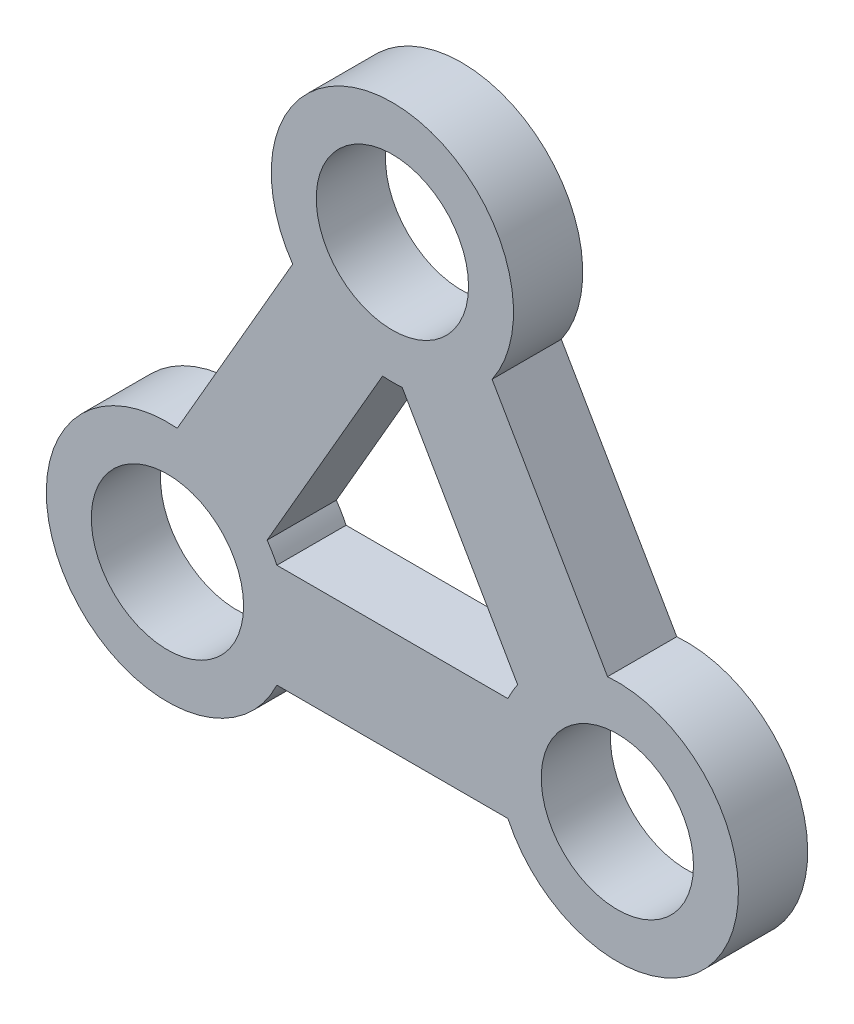
ISO-10303-21;
HEADER;
FILE_DESCRIPTION(('STEP AP214'),'2;1');
FILE_NAME('part.step','',(''),(''),'','','');
FILE_SCHEMA(('AUTOMOTIVE_DESIGN { 1 0 10303 214 1 1 1 1 }'));
ENDSEC;
DATA;
#1=APPLICATION_CONTEXT('core data for automotive mechanical design processes');
#2=APPLICATION_PROTOCOL_DEFINITION('international standard','automotive_design',2000,#1);
#3=PRODUCT_CONTEXT('',#1,'mechanical');
#4=PRODUCT('Part','Part','',(#3));
#5=PRODUCT_RELATED_PRODUCT_CATEGORY('part','',(#4));
#6=PRODUCT_DEFINITION_FORMATION('','',#4);
#7=PRODUCT_DEFINITION_CONTEXT('part definition',#1,'design');
#8=PRODUCT_DEFINITION('design','',#6,#7);
#9=PRODUCT_DEFINITION_SHAPE('','',#8);
#10=(LENGTH_UNIT() NAMED_UNIT(*) SI_UNIT(.MILLI.,.METRE.));
#11=(NAMED_UNIT(*) PLANE_ANGLE_UNIT() SI_UNIT($,.RADIAN.));
#12=(NAMED_UNIT(*) SI_UNIT($,.STERADIAN.) SOLID_ANGLE_UNIT());
#13=UNCERTAINTY_MEASURE_WITH_UNIT(LENGTH_MEASURE(1.E-05),#10,'distance_accuracy_value','');
#14=(GEOMETRIC_REPRESENTATION_CONTEXT(3) GLOBAL_UNCERTAINTY_ASSIGNED_CONTEXT((#13)) GLOBAL_UNIT_ASSIGNED_CONTEXT((#10,
#11,#12)) REPRESENTATION_CONTEXT('',''));
#15=CARTESIAN_POINT('',(0.,0.,0.));
#16=DIRECTION('',(0.,0.,1.));
#17=DIRECTION('',(1.,0.,0.));
#18=AXIS2_PLACEMENT_3D('',#15,#16,#17);
#19=CARTESIAN_POINT('',(0.,112.5,20.));
#20=DIRECTION('',(0.,0.,1.));
#21=DIRECTION('',(1.,0.,0.));
#22=AXIS2_PLACEMENT_3D('',#19,#20,#21);
#23=PLANE('',#22);
#24=CARTESIAN_POINT('',(0.,112.5,20.));
#25=DIRECTION('',(0.,0.,1.));
#26=DIRECTION('',(1.,0.,0.));
#27=AXIS2_PLACEMENT_3D('',#24,#25,#26);
#28=CIRCLE('',#27,22.);
#29=CARTESIAN_POINT('',(22.,112.5,20.));
#30=VERTEX_POINT('',#29);
#31=EDGE_CURVE('E262',#30,#30,#28,.T.);
#32=ORIENTED_EDGE('',*,*,#31,.F.);
#33=EDGE_LOOP('',(#32));
#34=FACE_BOUND('',#33,.T.);
#35=CARTESIAN_POINT('',(0.,112.5,20.));
#36=DIRECTION('',(0.,0.,1.));
#37=DIRECTION('',(1.,0.,0.));
#38=AXIS2_PLACEMENT_3D('',#35,#36,#37);
#39=CIRCLE('',#38,35.);
#40=CARTESIAN_POINT('',(-2.83219061774815,77.6147782534676,20.));
#41=VERTEX_POINT('',#40);
#42=CARTESIAN_POINT('',(2.83219061774815,77.6147782534676,20.));
#43=VERTEX_POINT('',#42);
#44=EDGE_CURVE('E229',#41,#43,#39,.T.);
#45=ORIENTED_EDGE('',*,*,#44,.T.);
#46=DIRECTION('',(0.500277597874629,-0.865865073244551,0.));
#47=VECTOR('',#46,1.);
#48=CARTESIAN_POINT('',(2.83219061774815,77.6147782534676,20.));
#49=LINE('',#48,#47);
#50=CARTESIAN_POINT('',(36.1918571849153,19.8768938102936,20.));
#51=VERTEX_POINT('',#50);
#52=EDGE_CURVE('E238',#43,#51,#49,.T.);
#53=ORIENTED_EDGE('',*,*,#52,.T.);
#54=CARTESIAN_POINT('',(65.,0.,20.));
#55=DIRECTION('',(0.,0.,1.));
#56=DIRECTION('',(1.,0.,0.));
#57=AXIS2_PLACEMENT_3D('',#54,#55,#56);
#58=CIRCLE('',#57,35.);
#59=CARTESIAN_POINT('',(33.3772233983162,15.,20.));
#60=VERTEX_POINT('',#59);
#61=EDGE_CURVE('E153',#51,#60,#58,.T.);
#62=ORIENTED_EDGE('',*,*,#61,.T.);
#63=DIRECTION('',(1.,0.,0.));
#64=VECTOR('',#63,1.);
#65=CARTESIAN_POINT('',(-33.3772233983162,15.,20.));
#66=LINE('',#65,#64);
#67=CARTESIAN_POINT('',(-33.3772233983162,15.,20.));
#68=VERTEX_POINT('',#67);
#69=EDGE_CURVE('E255',#68,#60,#66,.T.);
#70=ORIENTED_EDGE('',*,*,#69,.F.);
#71=CARTESIAN_POINT('',(-65.,0.,20.));
#72=DIRECTION('',(0.,0.,1.));
#73=DIRECTION('',(1.,0.,0.));
#74=AXIS2_PLACEMENT_3D('',#71,#72,#73);
#75=CIRCLE('',#74,35.);
#76=CARTESIAN_POINT('',(-36.1918571849153,19.8768938102936,20.));
#77=VERTEX_POINT('',#76);
#78=EDGE_CURVE('E257',#68,#77,#75,.T.);
#79=ORIENTED_EDGE('',*,*,#78,.T.);
#80=DIRECTION('',(0.500277597874629,0.865865073244551,0.));
#81=VECTOR('',#80,1.);
#82=CARTESIAN_POINT('',(-36.1918571849153,19.8768938102936,20.));
#83=LINE('',#82,#81);
#84=EDGE_CURVE('E235',#77,#41,#83,.T.);
#85=ORIENTED_EDGE('',*,*,#84,.T.);
#86=EDGE_LOOP('',(#45,#53,#62,#70,#79,#85));
#87=FACE_BOUND('',#86,.T.);
#88=CARTESIAN_POINT('',(0.,112.5,20.));
#89=DIRECTION('',(0.,0.,1.));
#90=DIRECTION('',(1.,0.,0.));
#91=AXIS2_PLACEMENT_3D('',#88,#89,#90);
#92=CIRCLE('',#91,35.);
#93=CARTESIAN_POINT('',(28.8081428150847,92.6231061897064,20.));
#94=VERTEX_POINT('',#93);
#95=CARTESIAN_POINT('',(-28.8081428150847,92.6231061897064,20.));
#96=VERTEX_POINT('',#95);
#97=EDGE_CURVE('E288',#94,#96,#92,.T.);
#98=ORIENTED_EDGE('',*,*,#97,.T.);
#99=DIRECTION('',(0.500277597874629,0.865865073244551,0.));
#100=VECTOR('',#99,1.);
#101=CARTESIAN_POINT('',(-62.1678093822519,34.8852217465324,20.));
#102=LINE('',#101,#100);
#103=CARTESIAN_POINT('',(-62.1678093822519,34.8852217465324,20.));
#104=VERTEX_POINT('',#103);
#105=EDGE_CURVE('E290',#104,#96,#102,.T.);
#106=ORIENTED_EDGE('',*,*,#105,.F.);
#107=CARTESIAN_POINT('',(-65.,0.,20.));
#108=DIRECTION('',(0.,0.,1.));
#109=DIRECTION('',(1.,0.,0.));
#110=AXIS2_PLACEMENT_3D('',#107,#108,#109);
#111=CIRCLE('',#110,35.);
#112=CARTESIAN_POINT('',(-33.3772233983162,-15.,20.));
#113=VERTEX_POINT('',#112);
#114=EDGE_CURVE('E294',#104,#113,#111,.T.);
#115=ORIENTED_EDGE('',*,*,#114,.T.);
#116=DIRECTION('',(1.,0.,0.));
#117=VECTOR('',#116,1.);
#118=CARTESIAN_POINT('',(-33.3772233983162,-15.,20.));
#119=LINE('',#118,#117);
#120=CARTESIAN_POINT('',(33.3772233983162,-15.,20.));
#121=VERTEX_POINT('',#120);
#122=EDGE_CURVE('E296',#113,#121,#119,.T.);
#123=ORIENTED_EDGE('',*,*,#122,.T.);
#124=CARTESIAN_POINT('',(65.,0.,20.));
#125=DIRECTION('',(0.,0.,1.));
#126=DIRECTION('',(1.,0.,0.));
#127=AXIS2_PLACEMENT_3D('',#124,#125,#126);
#128=CIRCLE('',#127,35.);
#129=CARTESIAN_POINT('',(62.1678093822519,34.8852217465324,20.));
#130=VERTEX_POINT('',#129);
#131=EDGE_CURVE('E298',#121,#130,#128,.T.);
#132=ORIENTED_EDGE('',*,*,#131,.T.);
#133=DIRECTION('',(0.500277597874629,-0.865865073244551,0.));
#134=VECTOR('',#133,1.);
#135=CARTESIAN_POINT('',(28.8081428150847,92.6231061897064,20.));
#136=LINE('',#135,#134);
#137=EDGE_CURVE('E300',#94,#130,#136,.T.);
#138=ORIENTED_EDGE('',*,*,#137,.F.);
#139=EDGE_LOOP('',(#98,#106,#115,#123,#132,#138));
#140=FACE_BOUND('',#139,.T.);
#141=CARTESIAN_POINT('',(-65.,0.,20.));
#142=DIRECTION('',(0.,0.,1.));
#143=DIRECTION('',(1.,0.,0.));
#144=AXIS2_PLACEMENT_3D('',#141,#142,#143);
#145=CIRCLE('',#144,22.);
#146=CARTESIAN_POINT('',(-43.,0.,20.));
#147=VERTEX_POINT('',#146);
#148=EDGE_CURVE('E282',#147,#147,#145,.T.);
#149=ORIENTED_EDGE('',*,*,#148,.F.);
#150=EDGE_LOOP('',(#149));
#151=FACE_BOUND('',#150,.T.);
#152=CARTESIAN_POINT('',(65.,0.,20.));
#153=DIRECTION('',(0.,0.,1.));
#154=DIRECTION('',(1.,0.,0.));
#155=AXIS2_PLACEMENT_3D('',#152,#153,#154);
#156=CIRCLE('',#155,22.);
#157=CARTESIAN_POINT('',(87.,0.,20.));
#158=VERTEX_POINT('',#157);
#159=EDGE_CURVE('E364',#158,#158,#156,.T.);
#160=ORIENTED_EDGE('',*,*,#159,.F.);
#161=EDGE_LOOP('',(#160));
#162=FACE_BOUND('',#161,.T.);
#163=ADVANCED_FACE('F138',(#34,#87,#140,#151,#162),#23,.T.);
#164=CARTESIAN_POINT('',(0.,112.5,0.));
#165=DIRECTION('',(0.,0.,1.));
#166=DIRECTION('',(1.,0.,0.));
#167=AXIS2_PLACEMENT_3D('',#164,#165,#166);
#168=PLANE('',#167);
#169=DIRECTION('',(0.500277597874629,-0.865865073244551,0.));
#170=VECTOR('',#169,1.);
#171=CARTESIAN_POINT('',(2.83219061774815,77.6147782534676,0.));
#172=LINE('',#171,#170);
#173=CARTESIAN_POINT('',(2.83219061774814,77.6147782534676,0.));
#174=VERTEX_POINT('',#173);
#175=CARTESIAN_POINT('',(36.1918571849153,19.8768938102936,0.));
#176=VERTEX_POINT('',#175);
#177=EDGE_CURVE('E261',#174,#176,#172,.T.);
#178=ORIENTED_EDGE('',*,*,#177,.F.);
#179=CARTESIAN_POINT('',(0.,112.5,0.));
#180=DIRECTION('',(0.,0.,1.));
#181=DIRECTION('',(1.,0.,0.));
#182=AXIS2_PLACEMENT_3D('',#179,#180,#181);
#183=CIRCLE('',#182,35.);
#184=CARTESIAN_POINT('',(-2.83219061774815,77.6147782534676,0.));
#185=VERTEX_POINT('',#184);
#186=EDGE_CURVE('E161',#185,#174,#183,.T.);
#187=ORIENTED_EDGE('',*,*,#186,.F.);
#188=DIRECTION('',(0.500277597874629,0.865865073244551,0.));
#189=VECTOR('',#188,1.);
#190=CARTESIAN_POINT('',(-36.1918571849153,19.8768938102936,0.));
#191=LINE('',#190,#189);
#192=CARTESIAN_POINT('',(-36.1918571849153,19.8768938102936,0.));
#193=VERTEX_POINT('',#192);
#194=EDGE_CURVE('E245',#193,#185,#191,.T.);
#195=ORIENTED_EDGE('',*,*,#194,.F.);
#196=CARTESIAN_POINT('',(-65.,0.,0.));
#197=DIRECTION('',(0.,0.,1.));
#198=DIRECTION('',(1.,0.,0.));
#199=AXIS2_PLACEMENT_3D('',#196,#197,#198);
#200=CIRCLE('',#199,35.);
#201=CARTESIAN_POINT('',(-33.3772233983162,15.,0.));
#202=VERTEX_POINT('',#201);
#203=EDGE_CURVE('E248',#202,#193,#200,.T.);
#204=ORIENTED_EDGE('',*,*,#203,.F.);
#205=DIRECTION('',(1.,0.,0.));
#206=VECTOR('',#205,1.);
#207=CARTESIAN_POINT('',(-33.3772233983162,15.,0.));
#208=LINE('',#207,#206);
#209=CARTESIAN_POINT('',(33.3772233983162,15.,0.));
#210=VERTEX_POINT('',#209);
#211=EDGE_CURVE('E267',#202,#210,#208,.T.);
#212=ORIENTED_EDGE('',*,*,#211,.T.);
#213=CARTESIAN_POINT('',(65.,0.,0.));
#214=DIRECTION('',(0.,0.,1.));
#215=DIRECTION('',(1.,0.,0.));
#216=AXIS2_PLACEMENT_3D('',#213,#214,#215);
#217=CIRCLE('',#216,35.);
#218=EDGE_CURVE('E264',#176,#210,#217,.T.);
#219=ORIENTED_EDGE('',*,*,#218,.F.);
#220=EDGE_LOOP('',(#178,#187,#195,#204,#212,#219));
#221=FACE_BOUND('',#220,.T.);
#222=CARTESIAN_POINT('',(0.,112.5,0.));
#223=DIRECTION('',(0.,0.,1.));
#224=DIRECTION('',(1.,0.,0.));
#225=AXIS2_PLACEMENT_3D('',#222,#223,#224);
#226=CIRCLE('',#225,35.);
#227=CARTESIAN_POINT('',(28.8081428150847,92.6231061897064,0.));
#228=VERTEX_POINT('',#227);
#229=CARTESIAN_POINT('',(-28.8081428150847,92.6231061897064,0.));
#230=VERTEX_POINT('',#229);
#231=EDGE_CURVE('E285',#228,#230,#226,.T.);
#232=ORIENTED_EDGE('',*,*,#231,.F.);
#233=DIRECTION('',(0.500277597874629,-0.865865073244551,0.));
#234=VECTOR('',#233,1.);
#235=CARTESIAN_POINT('',(28.8081428150847,92.6231061897064,0.));
#236=LINE('',#235,#234);
#237=CARTESIAN_POINT('',(62.1678093822519,34.8852217465324,0.));
#238=VERTEX_POINT('',#237);
#239=EDGE_CURVE('E291',#228,#238,#236,.T.);
#240=ORIENTED_EDGE('',*,*,#239,.T.);
#241=CARTESIAN_POINT('',(65.,0.,0.));
#242=DIRECTION('',(0.,0.,1.));
#243=DIRECTION('',(1.,0.,0.));
#244=AXIS2_PLACEMENT_3D('',#241,#242,#243);
#245=CIRCLE('',#244,35.);
#246=CARTESIAN_POINT('',(33.3772233983162,-15.,0.));
#247=VERTEX_POINT('',#246);
#248=EDGE_CURVE('E313',#247,#238,#245,.T.);
#249=ORIENTED_EDGE('',*,*,#248,.F.);
#250=DIRECTION('',(1.,0.,0.));
#251=VECTOR('',#250,1.);
#252=CARTESIAN_POINT('',(-33.3772233983162,-15.,0.));
#253=LINE('',#252,#251);
#254=CARTESIAN_POINT('',(-33.3772233983162,-15.,0.));
#255=VERTEX_POINT('',#254);
#256=EDGE_CURVE('E311',#255,#247,#253,.T.);
#257=ORIENTED_EDGE('',*,*,#256,.F.);
#258=CARTESIAN_POINT('',(-65.,0.,0.));
#259=DIRECTION('',(0.,0.,1.));
#260=DIRECTION('',(1.,0.,0.));
#261=AXIS2_PLACEMENT_3D('',#258,#259,#260);
#262=CIRCLE('',#261,35.);
#263=CARTESIAN_POINT('',(-62.1678093822519,34.8852217465324,0.));
#264=VERTEX_POINT('',#263);
#265=EDGE_CURVE('E309',#264,#255,#262,.T.);
#266=ORIENTED_EDGE('',*,*,#265,.F.);
#267=DIRECTION('',(0.500277597874629,0.865865073244551,0.));
#268=VECTOR('',#267,1.);
#269=CARTESIAN_POINT('',(-62.1678093822519,34.8852217465324,0.));
#270=LINE('',#269,#268);
#271=EDGE_CURVE('E306',#264,#230,#270,.T.);
#272=ORIENTED_EDGE('',*,*,#271,.T.);
#273=EDGE_LOOP('',(#232,#240,#249,#257,#266,#272));
#274=FACE_BOUND('',#273,.T.);
#275=CARTESIAN_POINT('',(-65.,0.,0.));
#276=DIRECTION('',(0.,0.,1.));
#277=DIRECTION('',(1.,0.,0.));
#278=AXIS2_PLACEMENT_3D('',#275,#276,#277);
#279=CIRCLE('',#278,22.);
#280=CARTESIAN_POINT('',(-43.,0.,0.));
#281=VERTEX_POINT('',#280);
#282=EDGE_CURVE('E274',#281,#281,#279,.T.);
#283=ORIENTED_EDGE('',*,*,#282,.T.);
#284=EDGE_LOOP('',(#283));
#285=FACE_BOUND('',#284,.T.);
#286=CARTESIAN_POINT('',(0.,112.5,0.));
#287=DIRECTION('',(0.,0.,1.));
#288=DIRECTION('',(1.,0.,0.));
#289=AXIS2_PLACEMENT_3D('',#286,#287,#288);
#290=CIRCLE('',#289,22.);
#291=CARTESIAN_POINT('',(22.,112.5,0.));
#292=VERTEX_POINT('',#291);
#293=EDGE_CURVE('E251',#292,#292,#290,.T.);
#294=ORIENTED_EDGE('',*,*,#293,.T.);
#295=EDGE_LOOP('',(#294));
#296=FACE_BOUND('',#295,.T.);
#297=CARTESIAN_POINT('',(65.,0.,0.));
#298=DIRECTION('',(0.,0.,1.));
#299=DIRECTION('',(1.,0.,0.));
#300=AXIS2_PLACEMENT_3D('',#297,#298,#299);
#301=CIRCLE('',#300,22.);
#302=CARTESIAN_POINT('',(87.,0.,0.));
#303=VERTEX_POINT('',#302);
#304=EDGE_CURVE('E366',#303,#303,#301,.T.);
#305=ORIENTED_EDGE('',*,*,#304,.T.);
#306=EDGE_LOOP('',(#305));
#307=FACE_BOUND('',#306,.T.);
#308=ADVANCED_FACE('F337',(#221,#274,#285,#296,#307),#168,.F.);
#309=CARTESIAN_POINT('',(0.,112.5,20.));
#310=DIRECTION('',(0.,0.,-1.));
#311=DIRECTION('',(-1.,0.,0.));
#312=AXIS2_PLACEMENT_3D('',#309,#310,#311);
#313=CYLINDRICAL_SURFACE('',#312,35.);
#314=ORIENTED_EDGE('',*,*,#231,.T.);
#315=DIRECTION('',(0.,0.,-1.));
#316=VECTOR('',#315,1.);
#317=CARTESIAN_POINT('',(-28.8081428150847,92.6231061897064,20.));
#318=LINE('',#317,#316);
#319=EDGE_CURVE('E12',#96,#230,#318,.T.);
#320=ORIENTED_EDGE('',*,*,#319,.F.);
#321=ORIENTED_EDGE('',*,*,#97,.F.);
#322=DIRECTION('',(0.,0.,-1.));
#323=VECTOR('',#322,1.);
#324=CARTESIAN_POINT('',(28.8081428150847,92.6231061897064,20.));
#325=LINE('',#324,#323);
#326=EDGE_CURVE('E303',#94,#228,#325,.T.);
#327=ORIENTED_EDGE('',*,*,#326,.T.);
#328=EDGE_LOOP('',(#314,#320,#321,#327));
#329=FACE_BOUND('',#328,.T.);
#330=ADVANCED_FACE('F140',(#329),#313,.T.);
#331=CARTESIAN_POINT('',(-62.1678093822519,34.8852217465324,20.));
#332=DIRECTION('',(-0.865865073244551,0.500277597874629,0.));
#333=DIRECTION('',(-0.500277597874629,-0.865865073244551,0.));
#334=AXIS2_PLACEMENT_3D('',#331,#332,#333);
#335=PLANE('',#334);
#336=ORIENTED_EDGE('',*,*,#271,.F.);
#337=DIRECTION('',(0.,0.,-1.));
#338=VECTOR('',#337,1.);
#339=CARTESIAN_POINT('',(-62.1678093822519,34.8852217465324,20.));
#340=LINE('',#339,#338);
#341=EDGE_CURVE('E146',#104,#264,#340,.T.);
#342=ORIENTED_EDGE('',*,*,#341,.F.);
#343=ORIENTED_EDGE('',*,*,#105,.T.);
#344=ORIENTED_EDGE('',*,*,#319,.T.);
#345=EDGE_LOOP('',(#336,#342,#343,#344));
#346=FACE_BOUND('',#345,.T.);
#347=ADVANCED_FACE('F340',(#346),#335,.T.);
#348=CARTESIAN_POINT('',(-65.,0.,20.));
#349=DIRECTION('',(0.,0.,-1.));
#350=DIRECTION('',(-1.,0.,0.));
#351=AXIS2_PLACEMENT_3D('',#348,#349,#350);
#352=CYLINDRICAL_SURFACE('',#351,35.);
#353=ORIENTED_EDGE('',*,*,#265,.T.);
#354=DIRECTION('',(0.,0.,-1.));
#355=VECTOR('',#354,1.);
#356=CARTESIAN_POINT('',(-33.3772233983162,-15.,20.));
#357=LINE('',#356,#355);
#358=EDGE_CURVE('E324',#113,#255,#357,.T.);
#359=ORIENTED_EDGE('',*,*,#358,.F.);
#360=ORIENTED_EDGE('',*,*,#114,.F.);
#361=ORIENTED_EDGE('',*,*,#341,.T.);
#362=EDGE_LOOP('',(#353,#359,#360,#361));
#363=FACE_BOUND('',#362,.T.);
#364=ADVANCED_FACE('F329',(#363),#352,.T.);
#365=CARTESIAN_POINT('',(-33.3772233983162,-15.,20.));
#366=DIRECTION('',(0.,1.,0.));
#367=DIRECTION('',(0.,0.,1.));
#368=AXIS2_PLACEMENT_3D('',#365,#366,#367);
#369=PLANE('',#368);
#370=ORIENTED_EDGE('',*,*,#256,.T.);
#371=DIRECTION('',(0.,0.,-1.));
#372=VECTOR('',#371,1.);
#373=CARTESIAN_POINT('',(33.3772233983162,-15.,20.));
#374=LINE('',#373,#372);
#375=EDGE_CURVE('E321',#121,#247,#374,.T.);
#376=ORIENTED_EDGE('',*,*,#375,.F.);
#377=ORIENTED_EDGE('',*,*,#122,.F.);
#378=ORIENTED_EDGE('',*,*,#358,.T.);
#379=EDGE_LOOP('',(#370,#376,#377,#378));
#380=FACE_BOUND('',#379,.T.);
#381=ADVANCED_FACE('F355',(#380),#369,.F.);
#382=CARTESIAN_POINT('',(65.,0.,20.));
#383=DIRECTION('',(0.,0.,-1.));
#384=DIRECTION('',(-1.,0.,0.));
#385=AXIS2_PLACEMENT_3D('',#382,#383,#384);
#386=CYLINDRICAL_SURFACE('',#385,35.);
#387=ORIENTED_EDGE('',*,*,#248,.T.);
#388=DIRECTION('',(0.,0.,-1.));
#389=VECTOR('',#388,1.);
#390=CARTESIAN_POINT('',(62.1678093822519,34.8852217465324,20.));
#391=LINE('',#390,#389);
#392=EDGE_CURVE('E319',#130,#238,#391,.T.);
#393=ORIENTED_EDGE('',*,*,#392,.F.);
#394=ORIENTED_EDGE('',*,*,#131,.F.);
#395=ORIENTED_EDGE('',*,*,#375,.T.);
#396=EDGE_LOOP('',(#387,#393,#394,#395));
#397=FACE_BOUND('',#396,.T.);
#398=ADVANCED_FACE('F351',(#397),#386,.T.);
#399=CARTESIAN_POINT('',(28.8081428150847,92.6231061897064,20.));
#400=DIRECTION('',(0.865865073244551,0.500277597874629,0.));
#401=DIRECTION('',(-0.500277597874629,0.865865073244551,0.));
#402=AXIS2_PLACEMENT_3D('',#399,#400,#401);
#403=PLANE('',#402);
#404=ORIENTED_EDGE('',*,*,#239,.F.);
#405=ORIENTED_EDGE('',*,*,#326,.F.);
#406=ORIENTED_EDGE('',*,*,#137,.T.);
#407=ORIENTED_EDGE('',*,*,#392,.T.);
#408=EDGE_LOOP('',(#404,#405,#406,#407));
#409=FACE_BOUND('',#408,.T.);
#410=ADVANCED_FACE('F346',(#409),#403,.T.);
#411=CARTESIAN_POINT('',(-65.,0.,20.));
#412=DIRECTION('',(0.,0.,-1.));
#413=DIRECTION('',(-1.,0.,0.));
#414=AXIS2_PLACEMENT_3D('',#411,#412,#413);
#415=CYLINDRICAL_SURFACE('',#414,22.);
#416=ORIENTED_EDGE('',*,*,#148,.T.);
#417=EDGE_LOOP('',(#416));
#418=FACE_BOUND('',#417,.T.);
#419=ORIENTED_EDGE('',*,*,#282,.F.);
#420=EDGE_LOOP('',(#419));
#421=FACE_BOUND('',#420,.T.);
#422=ADVANCED_FACE('F411',(#418,#421),#415,.F.);
#423=CARTESIAN_POINT('',(0.,112.5,20.));
#424=DIRECTION('',(0.,0.,-1.));
#425=DIRECTION('',(-1.,0.,0.));
#426=AXIS2_PLACEMENT_3D('',#423,#424,#425);
#427=CYLINDRICAL_SURFACE('',#426,35.);
#428=ORIENTED_EDGE('',*,*,#186,.T.);
#429=DIRECTION('',(0.,0.,-1.));
#430=VECTOR('',#429,1.);
#431=CARTESIAN_POINT('',(2.83219061774815,77.6147782534676,20.));
#432=LINE('',#431,#430);
#433=EDGE_CURVE('E225',#43,#174,#432,.T.);
#434=ORIENTED_EDGE('',*,*,#433,.F.);
#435=ORIENTED_EDGE('',*,*,#44,.F.);
#436=DIRECTION('',(0.,0.,-1.));
#437=VECTOR('',#436,1.);
#438=CARTESIAN_POINT('',(-2.83219061774815,77.6147782534676,20.));
#439=LINE('',#438,#437);
#440=EDGE_CURVE('E272',#41,#185,#439,.T.);
#441=ORIENTED_EDGE('',*,*,#440,.T.);
#442=EDGE_LOOP('',(#428,#434,#435,#441));
#443=FACE_BOUND('',#442,.T.);
#444=ADVANCED_FACE('F227',(#443),#427,.T.);
#445=CARTESIAN_POINT('',(-36.1918571849153,19.8768938102936,20.));
#446=DIRECTION('',(-0.865865073244551,0.500277597874629,0.));
#447=DIRECTION('',(-0.500277597874629,-0.865865073244551,0.));
#448=AXIS2_PLACEMENT_3D('',#445,#446,#447);
#449=PLANE('',#448);
#450=ORIENTED_EDGE('',*,*,#194,.T.);
#451=ORIENTED_EDGE('',*,*,#440,.F.);
#452=ORIENTED_EDGE('',*,*,#84,.F.);
#453=DIRECTION('',(0.,0.,-1.));
#454=VECTOR('',#453,1.);
#455=CARTESIAN_POINT('',(-36.1918571849153,19.8768938102936,20.));
#456=LINE('',#455,#454);
#457=EDGE_CURVE('E275',#77,#193,#456,.T.);
#458=ORIENTED_EDGE('',*,*,#457,.T.);
#459=EDGE_LOOP('',(#450,#451,#452,#458));
#460=FACE_BOUND('',#459,.T.);
#461=ADVANCED_FACE('F392',(#460),#449,.F.);
#462=CARTESIAN_POINT('',(-65.,0.,20.));
#463=DIRECTION('',(0.,0.,-1.));
#464=DIRECTION('',(-1.,0.,0.));
#465=AXIS2_PLACEMENT_3D('',#462,#463,#464);
#466=CYLINDRICAL_SURFACE('',#465,35.);
#467=ORIENTED_EDGE('',*,*,#203,.T.);
#468=ORIENTED_EDGE('',*,*,#457,.F.);
#469=ORIENTED_EDGE('',*,*,#78,.F.);
#470=DIRECTION('',(0.,0.,-1.));
#471=VECTOR('',#470,1.);
#472=CARTESIAN_POINT('',(-33.3772233983162,15.,20.));
#473=LINE('',#472,#471);
#474=EDGE_CURVE('E277',#68,#202,#473,.T.);
#475=ORIENTED_EDGE('',*,*,#474,.T.);
#476=EDGE_LOOP('',(#467,#468,#469,#475));
#477=FACE_BOUND('',#476,.T.);
#478=ADVANCED_FACE('F395',(#477),#466,.T.);
#479=CARTESIAN_POINT('',(-33.3772233983162,15.,20.));
#480=DIRECTION('',(0.,1.,0.));
#481=DIRECTION('',(0.,0.,1.));
#482=AXIS2_PLACEMENT_3D('',#479,#480,#481);
#483=PLANE('',#482);
#484=ORIENTED_EDGE('',*,*,#211,.F.);
#485=ORIENTED_EDGE('',*,*,#474,.F.);
#486=ORIENTED_EDGE('',*,*,#69,.T.);
#487=DIRECTION('',(0.,0.,-1.));
#488=VECTOR('',#487,1.);
#489=CARTESIAN_POINT('',(33.3772233983162,15.,20.));
#490=LINE('',#489,#488);
#491=EDGE_CURVE('E279',#60,#210,#490,.T.);
#492=ORIENTED_EDGE('',*,*,#491,.T.);
#493=EDGE_LOOP('',(#484,#485,#486,#492));
#494=FACE_BOUND('',#493,.T.);
#495=ADVANCED_FACE('F399',(#494),#483,.T.);
#496=CARTESIAN_POINT('',(65.,0.,20.));
#497=DIRECTION('',(0.,0.,-1.));
#498=DIRECTION('',(-1.,0.,0.));
#499=AXIS2_PLACEMENT_3D('',#496,#497,#498);
#500=CYLINDRICAL_SURFACE('',#499,35.);
#501=ORIENTED_EDGE('',*,*,#218,.T.);
#502=ORIENTED_EDGE('',*,*,#491,.F.);
#503=ORIENTED_EDGE('',*,*,#61,.F.);
#504=DIRECTION('',(0.,0.,-1.));
#505=VECTOR('',#504,1.);
#506=CARTESIAN_POINT('',(36.1918571849153,19.8768938102936,20.));
#507=LINE('',#506,#505);
#508=EDGE_CURVE('E234',#51,#176,#507,.T.);
#509=ORIENTED_EDGE('',*,*,#508,.T.);
#510=EDGE_LOOP('',(#501,#502,#503,#509));
#511=FACE_BOUND('',#510,.T.);
#512=ADVANCED_FACE('F403',(#511),#500,.T.);
#513=CARTESIAN_POINT('',(2.83219061774815,77.6147782534676,20.));
#514=DIRECTION('',(0.865865073244551,0.500277597874629,0.));
#515=DIRECTION('',(-0.500277597874629,0.865865073244551,0.));
#516=AXIS2_PLACEMENT_3D('',#513,#514,#515);
#517=PLANE('',#516);
#518=ORIENTED_EDGE('',*,*,#177,.T.);
#519=ORIENTED_EDGE('',*,*,#508,.F.);
#520=ORIENTED_EDGE('',*,*,#52,.F.);
#521=ORIENTED_EDGE('',*,*,#433,.T.);
#522=EDGE_LOOP('',(#518,#519,#520,#521));
#523=FACE_BOUND('',#522,.T.);
#524=ADVANCED_FACE('F239',(#523),#517,.F.);
#525=CARTESIAN_POINT('',(0.,112.5,20.));
#526=DIRECTION('',(0.,0.,-1.));
#527=DIRECTION('',(-1.,0.,0.));
#528=AXIS2_PLACEMENT_3D('',#525,#526,#527);
#529=CYLINDRICAL_SURFACE('',#528,22.);
#530=ORIENTED_EDGE('',*,*,#31,.T.);
#531=EDGE_LOOP('',(#530));
#532=FACE_BOUND('',#531,.T.);
#533=ORIENTED_EDGE('',*,*,#293,.F.);
#534=EDGE_LOOP('',(#533));
#535=FACE_BOUND('',#534,.T.);
#536=ADVANCED_FACE('F374',(#532,#535),#529,.F.);
#537=CARTESIAN_POINT('',(65.,0.,20.));
#538=DIRECTION('',(0.,0.,-1.));
#539=DIRECTION('',(-1.,0.,0.));
#540=AXIS2_PLACEMENT_3D('',#537,#538,#539);
#541=CYLINDRICAL_SURFACE('',#540,22.);
#542=ORIENTED_EDGE('',*,*,#159,.T.);
#543=EDGE_LOOP('',(#542));
#544=FACE_BOUND('',#543,.T.);
#545=ORIENTED_EDGE('',*,*,#304,.F.);
#546=EDGE_LOOP('',(#545));
#547=FACE_BOUND('',#546,.T.);
#548=ADVANCED_FACE('F377',(#544,#547),#541,.F.);
#549=CLOSED_SHELL('',(#163,#308,#330,#347,#364,#381,#398,#410,#422,#444,#461,#478,#495,#512,
#524,#536,#548));
#550=MANIFOLD_SOLID_BREP('B2',#549);
#551=ADVANCED_BREP_SHAPE_REPRESENTATION('',(#18,#550),#14);
#552=SHAPE_DEFINITION_REPRESENTATION(#9,#551);
ENDSEC;
END-ISO-10303-21;
